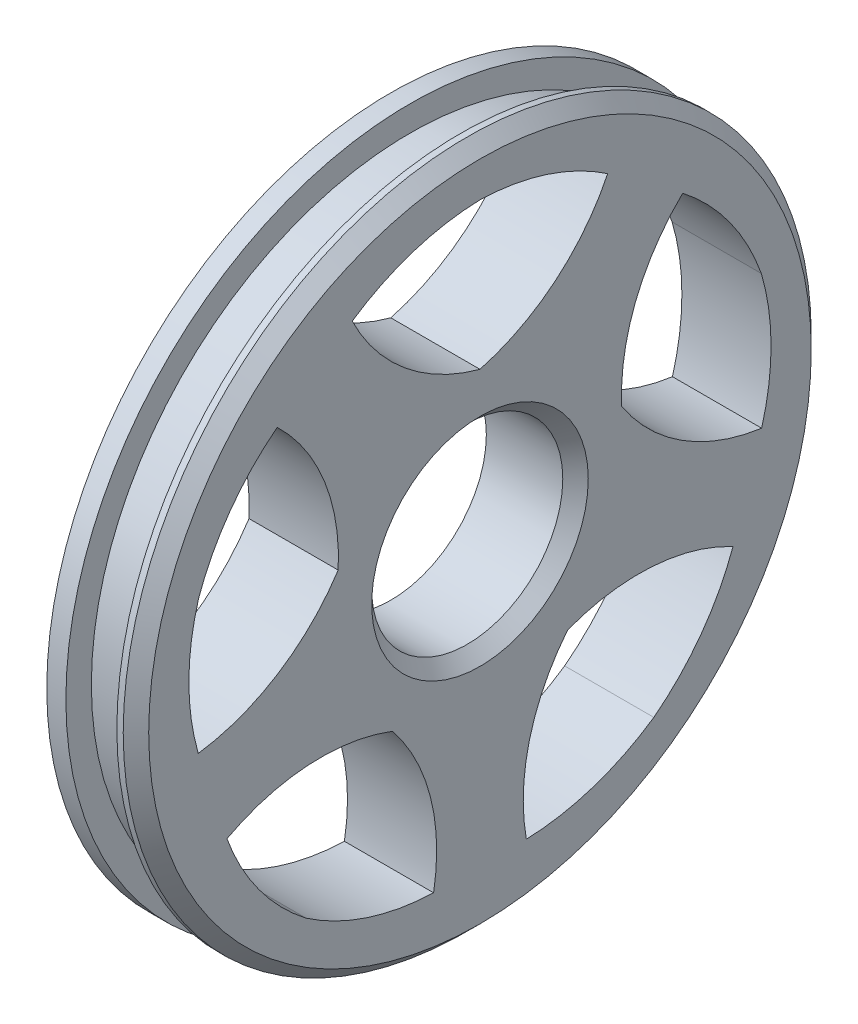
ISO-10303-21;
HEADER;
FILE_DESCRIPTION(('STEP AP214'),'2;1');
FILE_NAME('part.step','',(''),(''),'','','');
FILE_SCHEMA(('AUTOMOTIVE_DESIGN { 1 0 10303 214 1 1 1 1 }'));
ENDSEC;
DATA;
#1=APPLICATION_CONTEXT('core data for automotive mechanical design processes');
#2=APPLICATION_PROTOCOL_DEFINITION('international standard','automotive_design',2000,#1);
#3=PRODUCT_CONTEXT('',#1,'mechanical');
#4=PRODUCT('Part','Part','',(#3));
#5=PRODUCT_RELATED_PRODUCT_CATEGORY('part','',(#4));
#6=PRODUCT_DEFINITION_FORMATION('','',#4);
#7=PRODUCT_DEFINITION_CONTEXT('part definition',#1,'design');
#8=PRODUCT_DEFINITION('design','',#6,#7);
#9=PRODUCT_DEFINITION_SHAPE('','',#8);
#10=(LENGTH_UNIT() NAMED_UNIT(*) SI_UNIT(.MILLI.,.METRE.));
#11=(NAMED_UNIT(*) PLANE_ANGLE_UNIT() SI_UNIT($,.RADIAN.));
#12=(NAMED_UNIT(*) SI_UNIT($,.STERADIAN.) SOLID_ANGLE_UNIT());
#13=UNCERTAINTY_MEASURE_WITH_UNIT(LENGTH_MEASURE(1.E-05),#10,'distance_accuracy_value','');
#14=(GEOMETRIC_REPRESENTATION_CONTEXT(3) GLOBAL_UNCERTAINTY_ASSIGNED_CONTEXT((#13)) GLOBAL_UNIT_ASSIGNED_CONTEXT((#10,
#11,#12)) REPRESENTATION_CONTEXT('',''));
#15=CARTESIAN_POINT('',(0.,0.,0.));
#16=DIRECTION('',(0.,0.,1.));
#17=DIRECTION('',(1.,0.,0.));
#18=AXIS2_PLACEMENT_3D('',#15,#16,#17);
#19=CARTESIAN_POINT('',(1.75,0.,0.));
#20=DIRECTION('',(-1.,0.,0.));
#21=DIRECTION('',(0.,0.,1.));
#22=AXIS2_PLACEMENT_3D('',#19,#20,#21);
#23=CYLINDRICAL_SURFACE('',#22,13.5);
#24=CARTESIAN_POINT('',(-1.75,0.,0.));
#25=DIRECTION('',(1.,0.,0.));
#26=DIRECTION('',(0.,0.,-1.));
#27=AXIS2_PLACEMENT_3D('',#24,#25,#26);
#28=CIRCLE('',#27,13.5);
#29=CARTESIAN_POINT('',(-1.75,0.,-13.5));
#30=VERTEX_POINT('',#29);
#31=EDGE_CURVE('E341',#30,#30,#28,.T.);
#32=ORIENTED_EDGE('',*,*,#31,.T.);
#33=EDGE_LOOP('',(#32));
#34=FACE_BOUND('',#33,.T.);
#35=CARTESIAN_POINT('',(-1.,0.,0.));
#36=DIRECTION('',(1.,0.,0.));
#37=DIRECTION('',(0.,0.,-1.));
#38=AXIS2_PLACEMENT_3D('',#35,#36,#37);
#39=CIRCLE('',#38,13.5);
#40=CARTESIAN_POINT('',(-1.,0.,-13.5));
#41=VERTEX_POINT('',#40);
#42=EDGE_CURVE('E255',#41,#41,#39,.T.);
#43=ORIENTED_EDGE('',*,*,#42,.F.);
#44=EDGE_LOOP('',(#43));
#45=FACE_BOUND('',#44,.T.);
#46=ADVANCED_FACE('F37',(#34,#45),#23,.T.);
#47=CARTESIAN_POINT('',(1.75,0.,0.));
#48=DIRECTION('',(1.,0.,0.));
#49=DIRECTION('',(0.,0.,-1.));
#50=AXIS2_PLACEMENT_3D('',#47,#48,#49);
#51=PLANE('',#50);
#52=CARTESIAN_POINT('',(1.75,0.,0.));
#53=DIRECTION('',(1.,0.,0.));
#54=DIRECTION('',(0.,0.,-1.));
#55=AXIS2_PLACEMENT_3D('',#52,#53,#54);
#56=CIRCLE('',#55,4.25);
#57=CARTESIAN_POINT('',(1.75,0.,-4.25));
#58=VERTEX_POINT('',#57);
#59=EDGE_CURVE('E46',#58,#58,#56,.F.);
#60=ORIENTED_EDGE('',*,*,#59,.T.);
#61=EDGE_LOOP('',(#60));
#62=FACE_BOUND('',#61,.T.);
#63=CARTESIAN_POINT('',(1.75,0.,0.));
#64=DIRECTION('',(1.,0.,0.));
#65=DIRECTION('',(0.,0.,-1.));
#66=AXIS2_PLACEMENT_3D('',#63,#64,#65);
#67=CIRCLE('',#66,13.);
#68=CARTESIAN_POINT('',(1.75,0.,-13.));
#69=VERTEX_POINT('',#68);
#70=EDGE_CURVE('E347',#69,#69,#67,.T.);
#71=ORIENTED_EDGE('',*,*,#70,.T.);
#72=EDGE_LOOP('',(#71));
#73=FACE_BOUND('',#72,.T.);
#74=CARTESIAN_POINT('',(1.75,0.931815794103075,-2.02933749414677));
#75=DIRECTION('',(1.,0.,0.));
#76=DIRECTION('',(0.,-0.95105651629515,-0.309016994374958));
#77=AXIS2_PLACEMENT_3D('',#74,#75,#76);
#78=CIRCLE('',#77,9.39432433543306);
#79=CARTESIAN_POINT('',(1.75,-1.678595206542,-11.0536980879518));
#80=VERTEX_POINT('',#79);
#81=CARTESIAN_POINT('',(1.75,3.58728925984448,-11.0405410981085));
#82=VERTEX_POINT('',#81);
#83=EDGE_CURVE('E266',#80,#82,#78,.T.);
#84=ORIENTED_EDGE('',*,*,#83,.F.);
#85=CARTESIAN_POINT('',(1.75,6.08419028301145,-12.1309249973145));
#86=DIRECTION('',(1.,0.,0.));
#87=DIRECTION('',(0.,-0.95105651629515,-0.309016994374958));
#88=AXIS2_PLACEMENT_3D('',#85,#86,#87);
#89=CIRCLE('',#88,7.8371714521935);
#90=CARTESIAN_POINT('',(1.75,1.80765526838161,-5.56339086038598));
#91=VERTEX_POINT('',#90);
#92=EDGE_CURVE('E264',#91,#80,#89,.T.);
#93=ORIENTED_EDGE('',*,*,#92,.F.);
#94=CARTESIAN_POINT('',(1.75,2.2081654741207,-13.3903218008106));
#95=DIRECTION('',(1.,0.,0.));
#96=DIRECTION('',(0.,0.95105651629515,0.309016994374958));
#97=AXIS2_PLACEMENT_3D('',#94,#95,#96);
#98=CIRCLE('',#97,7.8371714521935);
#99=CARTESIAN_POINT('',(1.75,7.85521276816055,-7.95597609686846));
#100=VERTEX_POINT('',#99);
#101=EDGE_CURVE('E270',#100,#91,#98,.T.);
#102=ORIENTED_EDGE('',*,*,#101,.F.);
#103=CARTESIAN_POINT('',(1.75,0.43895983792731,-2.18947610171399));
#104=DIRECTION('',(1.,0.,0.));
#105=DIRECTION('',(0.,0.95105651629515,0.309016994374958));
#106=AXIS2_PLACEMENT_3D('',#103,#104,#105);
#107=CIRCLE('',#106,9.39432433543306);
#108=EDGE_CURVE('E268',#82,#100,#107,.T.);
#109=ORIENTED_EDGE('',*,*,#108,.F.);
#110=EDGE_LOOP('',(#84,#93,#102,#109));
#111=FACE_BOUND('',#110,.T.);
#112=CARTESIAN_POINT('',(1.75,-1.64206773156553,-1.51330925598209));
#113=DIRECTION('',(1.,0.,0.));
#114=DIRECTION('',(0.,-0.58778525229248,0.809016994374942));
#115=AXIS2_PLACEMENT_3D('',#112,#113,#114);
#116=CIRCLE('',#115,9.39432433543306);
#117=CARTESIAN_POINT('',(1.75,-11.0314060412036,-1.81934165046336));
#118=VERTEX_POINT('',#117);
#119=CARTESIAN_POINT('',(1.75,-9.3916452097499,-6.82342965282126));
#120=VERTEX_POINT('',#119);
#121=EDGE_CURVE('E240',#118,#120,#116,.T.);
#122=ORIENTED_EDGE('',*,*,#121,.F.);
#123=CARTESIAN_POINT('',(1.75,-9.65707707292231,-9.53507079669572));
#124=DIRECTION('',(1.,0.,0.));
#125=DIRECTION('',(0.,-0.58778525229248,0.809016994374942));
#126=AXIS2_PLACEMENT_3D('',#123,#124,#125);
#127=CIRCLE('',#126,7.8371714521935);
#128=CARTESIAN_POINT('',(1.75,-4.73250293256568,-3.43836464441911));
#129=VERTEX_POINT('',#128);
#130=EDGE_CURVE('E238',#129,#118,#127,.T.);
#131=ORIENTED_EDGE('',*,*,#130,.F.);
#132=CARTESIAN_POINT('',(1.75,-12.0525921460546,-6.23792715982025));
#133=DIRECTION('',(1.,0.,0.));
#134=DIRECTION('',(0.,0.58778525229248,-0.809016994374942));
#135=AXIS2_PLACEMENT_3D('',#132,#133,#134);
#136=CIRCLE('',#135,7.8371714521935);
#137=CARTESIAN_POINT('',(1.75,-5.13918867062257,-9.92928311081719));
#138=VERTEX_POINT('',#137);
#139=EDGE_CURVE('E244',#138,#129,#136,.T.);
#140=ORIENTED_EDGE('',*,*,#139,.F.);
#141=CARTESIAN_POINT('',(1.75,-1.94666946403999,-1.09406093846006));
#142=DIRECTION('',(1.,0.,0.));
#143=DIRECTION('',(0.,0.58778525229248,-0.809016994374942));
#144=AXIS2_PLACEMENT_3D('',#141,#142,#143);
#145=CIRCLE('',#144,9.39432433543306);
#146=EDGE_CURVE('E242',#120,#138,#145,.T.);
#147=ORIENTED_EDGE('',*,*,#146,.F.);
#148=EDGE_LOOP('',(#122,#131,#140,#147));
#149=FACE_BOUND('',#148,.T.);
#150=CARTESIAN_POINT('',(1.75,-1.94666946404,1.09406093846003));
#151=DIRECTION('',(1.,0.,0.));
#152=DIRECTION('',(0.,0.587785252292469,0.809016994374951));
#153=AXIS2_PLACEMENT_3D('',#150,#151,#152);
#154=CIRCLE('',#153,9.39432433543306);
#155=CARTESIAN_POINT('',(1.75,-5.13918867062272,9.92928311081712));
#156=VERTEX_POINT('',#155);
#157=CARTESIAN_POINT('',(1.75,-9.39164520975,6.82342965282112));
#158=VERTEX_POINT('',#157);
#159=EDGE_CURVE('E213',#156,#158,#154,.T.);
#160=ORIENTED_EDGE('',*,*,#159,.F.);
#161=CARTESIAN_POINT('',(1.75,-12.0525921460547,6.23792715982008));
#162=DIRECTION('',(1.,0.,0.));
#163=DIRECTION('',(0.,0.587785252292469,0.809016994374951));
#164=AXIS2_PLACEMENT_3D('',#161,#162,#163);
#165=CIRCLE('',#164,7.8371714521935);
#166=CARTESIAN_POINT('',(1.75,-4.73250293256573,3.43836464441905));
#167=VERTEX_POINT('',#166);
#168=EDGE_CURVE('E182',#167,#156,#165,.T.);
#169=ORIENTED_EDGE('',*,*,#168,.F.);
#170=CARTESIAN_POINT('',(1.75,-9.65707707292245,9.53507079669558));
#171=DIRECTION('',(1.,0.,0.));
#172=DIRECTION('',(0.,-0.587785252292469,-0.809016994374951));
#173=AXIS2_PLACEMENT_3D('',#170,#171,#172);
#174=CIRCLE('',#173,7.8371714521935);
#175=CARTESIAN_POINT('',(1.75,-11.0314060412037,1.81934165046321));
#176=VERTEX_POINT('',#175);
#177=EDGE_CURVE('E218',#176,#167,#174,.T.);
#178=ORIENTED_EDGE('',*,*,#177,.F.);
#179=CARTESIAN_POINT('',(1.75,-1.64206773156555,1.51330925598207));
#180=DIRECTION('',(1.,0.,0.));
#181=DIRECTION('',(0.,-0.587785252292469,-0.809016994374951));
#182=AXIS2_PLACEMENT_3D('',#179,#180,#181);
#183=CIRCLE('',#182,9.39432433543306);
#184=EDGE_CURVE('E215',#158,#176,#183,.T.);
#185=ORIENTED_EDGE('',*,*,#184,.F.);
#186=EDGE_LOOP('',(#160,#169,#178,#185));
#187=FACE_BOUND('',#186,.T.);
#188=CARTESIAN_POINT('',(1.75,0.438959837927279,2.18947610171399));
#189=DIRECTION('',(1.,0.,0.));
#190=DIRECTION('',(0.,0.951056516295155,-0.309016994374945));
#191=AXIS2_PLACEMENT_3D('',#188,#189,#190);
#192=CIRCLE('',#191,9.39432433543306);
#193=CARTESIAN_POINT('',(1.75,7.85521276816044,7.95597609686858));
#194=VERTEX_POINT('',#193);
#195=CARTESIAN_POINT('',(1.75,3.58728925984432,11.0405410981086));
#196=VERTEX_POINT('',#195);
#197=EDGE_CURVE('E292',#194,#196,#192,.T.);
#198=ORIENTED_EDGE('',*,*,#197,.F.);
#199=CARTESIAN_POINT('',(1.75,2.20816547412051,13.3903218008106));
#200=DIRECTION('',(1.,0.,0.));
#201=DIRECTION('',(0.,0.951056516295155,-0.309016994374945));
#202=AXIS2_PLACEMENT_3D('',#199,#200,#201);
#203=CIRCLE('',#202,7.8371714521935);
#204=CARTESIAN_POINT('',(1.75,1.80765526838153,5.56339086038601));
#205=VERTEX_POINT('',#204);
#206=EDGE_CURVE('E290',#205,#194,#203,.T.);
#207=ORIENTED_EDGE('',*,*,#206,.F.);
#208=CARTESIAN_POINT('',(1.75,6.08419028301128,12.1309249973146));
#209=DIRECTION('',(1.,0.,0.));
#210=DIRECTION('',(0.,-0.951056516295155,0.309016994374945));
#211=AXIS2_PLACEMENT_3D('',#208,#209,#210);
#212=CIRCLE('',#211,7.8371714521935);
#213=CARTESIAN_POINT('',(1.75,-1.67859520654215,11.0536980879518));
#214=VERTEX_POINT('',#213);
#215=EDGE_CURVE('E297',#214,#205,#212,.T.);
#216=ORIENTED_EDGE('',*,*,#215,.F.);
#217=CARTESIAN_POINT('',(1.75,0.931815794103047,2.02933749414678));
#218=DIRECTION('',(1.,0.,0.));
#219=DIRECTION('',(0.,-0.951056516295155,0.309016994374945));
#220=AXIS2_PLACEMENT_3D('',#217,#218,#219);
#221=CIRCLE('',#220,9.39432433543306);
#222=EDGE_CURVE('E294',#196,#214,#221,.T.);
#223=ORIENTED_EDGE('',*,*,#222,.F.);
#224=EDGE_LOOP('',(#198,#207,#216,#223));
#225=FACE_BOUND('',#224,.T.);
#226=CARTESIAN_POINT('',(1.75,2.21796156357521,0.259109709954825));
#227=DIRECTION('',(1.,0.,0.));
#228=DIRECTION('',(0.,0.,-1.));
#229=AXIS2_PLACEMENT_3D('',#226,#227,#228);
#230=CIRCLE('',#229,9.39432433543306);
#231=CARTESIAN_POINT('',(1.75,9.99397715020798,-5.01221946927066));
#232=VERTEX_POINT('',#231);
#233=CARTESIAN_POINT('',(1.75,11.6087118998112,0.));
#234=VERTEX_POINT('',#233);
#235=EDGE_CURVE('E322',#232,#234,#230,.T.);
#236=ORIENTED_EDGE('',*,*,#235,.F.);
#237=CARTESIAN_POINT('',(1.75,13.4173134618452,2.03774683337949));
#238=DIRECTION('',(1.,0.,0.));
#239=DIRECTION('',(0.,0.,-1.));
#240=AXIS2_PLACEMENT_3D('',#237,#238,#239);
#241=CIRCLE('',#240,7.8371714521935);
#242=CARTESIAN_POINT('',(1.75,5.84969532836832,0.));
#243=VERTEX_POINT('',#242);
#244=EDGE_CURVE('E320',#243,#232,#241,.T.);
#245=ORIENTED_EDGE('',*,*,#244,.F.);
#246=CARTESIAN_POINT('',(1.75,13.4173134618452,-2.03774683337949));
#247=DIRECTION('',(1.,0.,0.));
#248=DIRECTION('',(0.,0.,1.));
#249=AXIS2_PLACEMENT_3D('',#246,#247,#248);
#250=CIRCLE('',#249,7.8371714521935);
#251=CARTESIAN_POINT('',(1.75,9.99397715020798,5.01221946927066));
#252=VERTEX_POINT('',#251);
#253=EDGE_CURVE('E327',#252,#243,#250,.T.);
#254=ORIENTED_EDGE('',*,*,#253,.F.);
#255=CARTESIAN_POINT('',(1.75,2.21796156357521,-0.259109709954825));
#256=DIRECTION('',(1.,0.,0.));
#257=DIRECTION('',(0.,0.,1.));
#258=AXIS2_PLACEMENT_3D('',#255,#256,#257);
#259=CIRCLE('',#258,9.39432433543306);
#260=EDGE_CURVE('E324',#234,#252,#259,.T.);
#261=ORIENTED_EDGE('',*,*,#260,.F.);
#262=EDGE_LOOP('',(#236,#245,#254,#261));
#263=FACE_BOUND('',#262,.T.);
#264=ADVANCED_FACE('F352',(#62,#73,#111,#149,#187,#225,#263),#51,.T.);
#265=CARTESIAN_POINT('',(-1.75,0.,0.));
#266=DIRECTION('',(1.,0.,0.));
#267=DIRECTION('',(0.,0.,-1.));
#268=AXIS2_PLACEMENT_3D('',#265,#266,#267);
#269=PLANE('',#268);
#270=CARTESIAN_POINT('',(-1.75,6.08419028301145,-12.1309249973145));
#271=DIRECTION('',(1.,0.,0.));
#272=DIRECTION('',(0.,-0.95105651629515,-0.309016994374958));
#273=AXIS2_PLACEMENT_3D('',#270,#271,#272);
#274=CIRCLE('',#273,7.8371714521935);
#275=CARTESIAN_POINT('',(-1.75,1.80765526838161,-5.56339086038598));
#276=VERTEX_POINT('',#275);
#277=CARTESIAN_POINT('',(-1.75,-1.678595206542,-11.0536980879518));
#278=VERTEX_POINT('',#277);
#279=EDGE_CURVE('E251',#276,#278,#274,.T.);
#280=ORIENTED_EDGE('',*,*,#279,.T.);
#281=CARTESIAN_POINT('',(-1.75,0.931815794103075,-2.02933749414677));
#282=DIRECTION('',(1.,0.,0.));
#283=DIRECTION('',(0.,-0.95105651629515,-0.309016994374958));
#284=AXIS2_PLACEMENT_3D('',#281,#282,#283);
#285=CIRCLE('',#284,9.39432433543306);
#286=CARTESIAN_POINT('',(-1.75,3.58728925984448,-11.0405410981085));
#287=VERTEX_POINT('',#286);
#288=EDGE_CURVE('E254',#278,#287,#285,.T.);
#289=ORIENTED_EDGE('',*,*,#288,.T.);
#290=CARTESIAN_POINT('',(-1.75,0.43895983792731,-2.18947610171399));
#291=DIRECTION('',(1.,0.,0.));
#292=DIRECTION('',(0.,0.95105651629515,0.309016994374958));
#293=AXIS2_PLACEMENT_3D('',#290,#291,#292);
#294=CIRCLE('',#293,9.39432433543306);
#295=CARTESIAN_POINT('',(-1.75,7.85521276816055,-7.95597609686846));
#296=VERTEX_POINT('',#295);
#297=EDGE_CURVE('E258',#287,#296,#294,.T.);
#298=ORIENTED_EDGE('',*,*,#297,.T.);
#299=CARTESIAN_POINT('',(-1.75,2.2081654741207,-13.3903218008106));
#300=DIRECTION('',(1.,0.,0.));
#301=DIRECTION('',(0.,0.95105651629515,0.309016994374958));
#302=AXIS2_PLACEMENT_3D('',#299,#300,#301);
#303=CIRCLE('',#302,7.8371714521935);
#304=EDGE_CURVE('E261',#296,#276,#303,.T.);
#305=ORIENTED_EDGE('',*,*,#304,.T.);
#306=EDGE_LOOP('',(#280,#289,#298,#305));
#307=FACE_BOUND('',#306,.T.);
#308=CARTESIAN_POINT('',(-1.75,-9.65707707292231,-9.53507079669572));
#309=DIRECTION('',(1.,0.,0.));
#310=DIRECTION('',(0.,-0.58778525229248,0.809016994374942));
#311=AXIS2_PLACEMENT_3D('',#308,#309,#310);
#312=CIRCLE('',#311,7.8371714521935);
#313=CARTESIAN_POINT('',(-1.75,-4.73250293256567,-3.43836464441911));
#314=VERTEX_POINT('',#313);
#315=CARTESIAN_POINT('',(-1.75,-11.0314060412036,-1.81934165046336));
#316=VERTEX_POINT('',#315);
#317=EDGE_CURVE('E225',#314,#316,#312,.T.);
#318=ORIENTED_EDGE('',*,*,#317,.T.);
#319=CARTESIAN_POINT('',(-1.75,-1.64206773156553,-1.51330925598209));
#320=DIRECTION('',(1.,0.,0.));
#321=DIRECTION('',(0.,-0.58778525229248,0.809016994374942));
#322=AXIS2_PLACEMENT_3D('',#319,#320,#321);
#323=CIRCLE('',#322,9.39432433543306);
#324=CARTESIAN_POINT('',(-1.75,-9.3916452097499,-6.82342965282126));
#325=VERTEX_POINT('',#324);
#326=EDGE_CURVE('E228',#316,#325,#323,.T.);
#327=ORIENTED_EDGE('',*,*,#326,.T.);
#328=CARTESIAN_POINT('',(-1.75,-1.94666946403999,-1.09406093846006));
#329=DIRECTION('',(1.,0.,0.));
#330=DIRECTION('',(0.,0.58778525229248,-0.809016994374942));
#331=AXIS2_PLACEMENT_3D('',#328,#329,#330);
#332=CIRCLE('',#331,9.39432433543306);
#333=CARTESIAN_POINT('',(-1.75,-5.13918867062257,-9.92928311081719));
#334=VERTEX_POINT('',#333);
#335=EDGE_CURVE('E232',#325,#334,#332,.T.);
#336=ORIENTED_EDGE('',*,*,#335,.T.);
#337=CARTESIAN_POINT('',(-1.75,-12.0525921460546,-6.23792715982025));
#338=DIRECTION('',(1.,0.,0.));
#339=DIRECTION('',(0.,0.58778525229248,-0.809016994374942));
#340=AXIS2_PLACEMENT_3D('',#337,#338,#339);
#341=CIRCLE('',#340,7.8371714521935);
#342=EDGE_CURVE('E235',#334,#314,#341,.T.);
#343=ORIENTED_EDGE('',*,*,#342,.T.);
#344=EDGE_LOOP('',(#318,#327,#336,#343));
#345=FACE_BOUND('',#344,.T.);
#346=CARTESIAN_POINT('',(-1.75,-12.0525921460547,6.23792715982008));
#347=DIRECTION('',(1.,0.,0.));
#348=DIRECTION('',(0.,0.587785252292469,0.809016994374951));
#349=AXIS2_PLACEMENT_3D('',#346,#347,#348);
#350=CIRCLE('',#349,7.8371714521935);
#351=CARTESIAN_POINT('',(-1.75,-4.73250293256573,3.43836464441905));
#352=VERTEX_POINT('',#351);
#353=CARTESIAN_POINT('',(-1.75,-5.13918867062272,9.92928311081712));
#354=VERTEX_POINT('',#353);
#355=EDGE_CURVE('E179',#352,#354,#350,.T.);
#356=ORIENTED_EDGE('',*,*,#355,.T.);
#357=CARTESIAN_POINT('',(-1.75,-1.94666946404,1.09406093846003));
#358=DIRECTION('',(1.,0.,0.));
#359=DIRECTION('',(0.,0.587785252292469,0.809016994374951));
#360=AXIS2_PLACEMENT_3D('',#357,#358,#359);
#361=CIRCLE('',#360,9.39432433543306);
#362=CARTESIAN_POINT('',(-1.75,-9.39164520975,6.82342965282112));
#363=VERTEX_POINT('',#362);
#364=EDGE_CURVE('E189',#354,#363,#361,.T.);
#365=ORIENTED_EDGE('',*,*,#364,.T.);
#366=CARTESIAN_POINT('',(-1.75,-1.64206773156555,1.51330925598207));
#367=DIRECTION('',(1.,0.,0.));
#368=DIRECTION('',(0.,-0.587785252292469,-0.809016994374951));
#369=AXIS2_PLACEMENT_3D('',#366,#367,#368);
#370=CIRCLE('',#369,9.39432433543306);
#371=CARTESIAN_POINT('',(-1.75,-11.0314060412037,1.8193416504632));
#372=VERTEX_POINT('',#371);
#373=EDGE_CURVE('E195',#363,#372,#370,.T.);
#374=ORIENTED_EDGE('',*,*,#373,.T.);
#375=CARTESIAN_POINT('',(-1.75,-9.65707707292245,9.53507079669558));
#376=DIRECTION('',(1.,0.,0.));
#377=DIRECTION('',(0.,-0.587785252292469,-0.809016994374951));
#378=AXIS2_PLACEMENT_3D('',#375,#376,#377);
#379=CIRCLE('',#378,7.8371714521935);
#380=EDGE_CURVE('E201',#372,#352,#379,.T.);
#381=ORIENTED_EDGE('',*,*,#380,.T.);
#382=EDGE_LOOP('',(#356,#365,#374,#381));
#383=FACE_BOUND('',#382,.T.);
#384=CARTESIAN_POINT('',(-1.75,2.20816547412051,13.3903218008106));
#385=DIRECTION('',(1.,0.,0.));
#386=DIRECTION('',(0.,0.951056516295155,-0.309016994374945));
#387=AXIS2_PLACEMENT_3D('',#384,#385,#386);
#388=CIRCLE('',#387,7.8371714521935);
#389=CARTESIAN_POINT('',(-1.75,1.80765526838153,5.56339086038601));
#390=VERTEX_POINT('',#389);
#391=CARTESIAN_POINT('',(-1.75,7.85521276816044,7.95597609686858));
#392=VERTEX_POINT('',#391);
#393=EDGE_CURVE('E185',#390,#392,#388,.T.);
#394=ORIENTED_EDGE('',*,*,#393,.T.);
#395=CARTESIAN_POINT('',(-1.75,0.438959837927279,2.18947610171399));
#396=DIRECTION('',(1.,0.,0.));
#397=DIRECTION('',(0.,0.951056516295155,-0.309016994374945));
#398=AXIS2_PLACEMENT_3D('',#395,#396,#397);
#399=CIRCLE('',#398,9.39432433543306);
#400=CARTESIAN_POINT('',(-1.75,3.58728925984432,11.0405410981086));
#401=VERTEX_POINT('',#400);
#402=EDGE_CURVE('E281',#392,#401,#399,.T.);
#403=ORIENTED_EDGE('',*,*,#402,.T.);
#404=CARTESIAN_POINT('',(-1.75,0.931815794103047,2.02933749414678));
#405=DIRECTION('',(1.,0.,0.));
#406=DIRECTION('',(0.,-0.951056516295155,0.309016994374945));
#407=AXIS2_PLACEMENT_3D('',#404,#405,#406);
#408=CIRCLE('',#407,9.39432433543306);
#409=CARTESIAN_POINT('',(-1.75,-1.67859520654215,11.0536980879518));
#410=VERTEX_POINT('',#409);
#411=EDGE_CURVE('E284',#401,#410,#408,.T.);
#412=ORIENTED_EDGE('',*,*,#411,.T.);
#413=CARTESIAN_POINT('',(-1.75,6.08419028301128,12.1309249973146));
#414=DIRECTION('',(1.,0.,0.));
#415=DIRECTION('',(0.,-0.951056516295155,0.309016994374945));
#416=AXIS2_PLACEMENT_3D('',#413,#414,#415);
#417=CIRCLE('',#416,7.8371714521935);
#418=EDGE_CURVE('E287',#410,#390,#417,.T.);
#419=ORIENTED_EDGE('',*,*,#418,.T.);
#420=EDGE_LOOP('',(#394,#403,#412,#419));
#421=FACE_BOUND('',#420,.T.);
#422=CARTESIAN_POINT('',(-1.75,13.4173134618452,2.03774683337949));
#423=DIRECTION('',(1.,0.,0.));
#424=DIRECTION('',(0.,0.,-1.));
#425=AXIS2_PLACEMENT_3D('',#422,#423,#424);
#426=CIRCLE('',#425,7.8371714521935);
#427=CARTESIAN_POINT('',(-1.75,5.84969532836832,0.));
#428=VERTEX_POINT('',#427);
#429=CARTESIAN_POINT('',(-1.75,9.99397715020798,-5.01221946927066));
#430=VERTEX_POINT('',#429);
#431=EDGE_CURVE('E308',#428,#430,#426,.T.);
#432=ORIENTED_EDGE('',*,*,#431,.T.);
#433=CARTESIAN_POINT('',(-1.75,2.21796156357521,0.259109709954825));
#434=DIRECTION('',(1.,0.,0.));
#435=DIRECTION('',(0.,0.,-1.));
#436=AXIS2_PLACEMENT_3D('',#433,#434,#435);
#437=CIRCLE('',#436,9.39432433543306);
#438=CARTESIAN_POINT('',(-1.75,11.6087118998112,0.));
#439=VERTEX_POINT('',#438);
#440=EDGE_CURVE('E311',#430,#439,#437,.T.);
#441=ORIENTED_EDGE('',*,*,#440,.T.);
#442=CARTESIAN_POINT('',(-1.75,2.21796156357521,-0.259109709954825));
#443=DIRECTION('',(1.,0.,0.));
#444=DIRECTION('',(0.,0.,1.));
#445=AXIS2_PLACEMENT_3D('',#442,#443,#444);
#446=CIRCLE('',#445,9.39432433543306);
#447=CARTESIAN_POINT('',(-1.75,9.99397715020798,5.01221946927066));
#448=VERTEX_POINT('',#447);
#449=EDGE_CURVE('E314',#439,#448,#446,.T.);
#450=ORIENTED_EDGE('',*,*,#449,.T.);
#451=CARTESIAN_POINT('',(-1.75,13.4173134618452,-2.03774683337949));
#452=DIRECTION('',(1.,0.,0.));
#453=DIRECTION('',(0.,0.,1.));
#454=AXIS2_PLACEMENT_3D('',#451,#452,#453);
#455=CIRCLE('',#454,7.8371714521935);
#456=EDGE_CURVE('E317',#448,#428,#455,.T.);
#457=ORIENTED_EDGE('',*,*,#456,.T.);
#458=EDGE_LOOP('',(#432,#441,#450,#457));
#459=FACE_BOUND('',#458,.T.);
#460=ORIENTED_EDGE('',*,*,#31,.F.);
#461=EDGE_LOOP('',(#460));
#462=FACE_BOUND('',#461,.T.);
#463=CARTESIAN_POINT('',(-1.75,0.,0.));
#464=DIRECTION('',(1.,0.,0.));
#465=DIRECTION('',(0.,0.,-1.));
#466=AXIS2_PLACEMENT_3D('',#463,#464,#465);
#467=CIRCLE('',#466,3.75);
#468=CARTESIAN_POINT('',(-1.75,0.,-3.75));
#469=VERTEX_POINT('',#468);
#470=EDGE_CURVE('E338',#469,#469,#467,.T.);
#471=ORIENTED_EDGE('',*,*,#470,.T.);
#472=EDGE_LOOP('',(#471));
#473=FACE_BOUND('',#472,.T.);
#474=ADVANCED_FACE('F198',(#307,#345,#383,#421,#459,#462,#473),#269,.F.);
#475=CARTESIAN_POINT('',(1.,0.,0.));
#476=DIRECTION('',(1.,0.,0.));
#477=DIRECTION('',(0.,0.,-1.));
#478=AXIS2_PLACEMENT_3D('',#475,#476,#477);
#479=CIRCLE('',#478,13.5);
#480=CARTESIAN_POINT('',(1.,0.,-13.5));
#481=VERTEX_POINT('',#480);
#482=EDGE_CURVE('E207',#481,#481,#479,.T.);
#483=ORIENTED_EDGE('',*,*,#482,.T.);
#484=EDGE_LOOP('',(#483));
#485=FACE_BOUND('',#484,.T.);
#486=CARTESIAN_POINT('',(1.24999999999999,0.,0.));
#487=DIRECTION('',(1.,0.,0.));
#488=DIRECTION('',(0.,0.,-1.));
#489=AXIS2_PLACEMENT_3D('',#486,#487,#488);
#490=CIRCLE('',#489,13.5);
#491=CARTESIAN_POINT('',(1.24999999999999,0.,-13.5));
#492=VERTEX_POINT('',#491);
#493=EDGE_CURVE('E11',#492,#492,#490,.F.);
#494=ORIENTED_EDGE('',*,*,#493,.T.);
#495=EDGE_LOOP('',(#494));
#496=FACE_BOUND('',#495,.T.);
#497=ADVANCED_FACE('F365',(#485,#496),#23,.T.);
#498=CARTESIAN_POINT('',(1.75,0.,0.));
#499=DIRECTION('',(-1.,0.,0.));
#500=DIRECTION('',(0.,0.,1.));
#501=AXIS2_PLACEMENT_3D('',#498,#499,#500);
#502=CYLINDRICAL_SURFACE('',#501,3.75);
#503=CARTESIAN_POINT('',(1.25000000000001,0.,0.));
#504=DIRECTION('',(1.,0.,0.));
#505=DIRECTION('',(0.,0.,-1.));
#506=AXIS2_PLACEMENT_3D('',#503,#504,#505);
#507=CIRCLE('',#506,3.75);
#508=CARTESIAN_POINT('',(1.25000000000001,0.,-3.75));
#509=VERTEX_POINT('',#508);
#510=EDGE_CURVE('E344',#509,#509,#507,.T.);
#511=ORIENTED_EDGE('',*,*,#510,.T.);
#512=EDGE_LOOP('',(#511));
#513=FACE_BOUND('',#512,.T.);
#514=ORIENTED_EDGE('',*,*,#470,.F.);
#515=EDGE_LOOP('',(#514));
#516=FACE_BOUND('',#515,.T.);
#517=ADVANCED_FACE('F361',(#513,#516),#502,.F.);
#518=CARTESIAN_POINT('',(1.75,13.4173134618452,2.03774683337949));
#519=DIRECTION('',(-1.,0.,0.));
#520=DIRECTION('',(0.,0.,1.));
#521=AXIS2_PLACEMENT_3D('',#518,#519,#520);
#522=CYLINDRICAL_SURFACE('',#521,7.8371714521935);
#523=DIRECTION('',(-1.,0.,0.));
#524=VECTOR('',#523,1.);
#525=CARTESIAN_POINT('',(1.75,5.84969532836832,0.));
#526=LINE('',#525,#524);
#527=EDGE_CURVE('E329',#243,#428,#526,.T.);
#528=ORIENTED_EDGE('',*,*,#527,.F.);
#529=ORIENTED_EDGE('',*,*,#244,.T.);
#530=DIRECTION('',(-1.,0.,0.));
#531=VECTOR('',#530,1.);
#532=CARTESIAN_POINT('',(1.75,9.99397715020798,-5.01221946927066));
#533=LINE('',#532,#531);
#534=EDGE_CURVE('E336',#232,#430,#533,.T.);
#535=ORIENTED_EDGE('',*,*,#534,.T.);
#536=ORIENTED_EDGE('',*,*,#431,.F.);
#537=EDGE_LOOP('',(#528,#529,#535,#536));
#538=FACE_BOUND('',#537,.T.);
#539=ADVANCED_FACE('F364',(#538),#522,.F.);
#540=CARTESIAN_POINT('',(1.75,2.21796156357521,0.259109709954825));
#541=DIRECTION('',(-1.,0.,0.));
#542=DIRECTION('',(0.,0.,1.));
#543=AXIS2_PLACEMENT_3D('',#540,#541,#542);
#544=CYLINDRICAL_SURFACE('',#543,9.39432433543306);
#545=ORIENTED_EDGE('',*,*,#534,.F.);
#546=ORIENTED_EDGE('',*,*,#235,.T.);
#547=DIRECTION('',(-1.,0.,0.));
#548=VECTOR('',#547,1.);
#549=CARTESIAN_POINT('',(1.75,11.6087118998112,0.));
#550=LINE('',#549,#548);
#551=EDGE_CURVE('E334',#234,#439,#550,.T.);
#552=ORIENTED_EDGE('',*,*,#551,.T.);
#553=ORIENTED_EDGE('',*,*,#440,.F.);
#554=EDGE_LOOP('',(#545,#546,#552,#553));
#555=FACE_BOUND('',#554,.T.);
#556=ADVANCED_FACE('F483',(#555),#544,.F.);
#557=CARTESIAN_POINT('',(1.75,2.21796156357521,-0.259109709954825));
#558=DIRECTION('',(-1.,0.,0.));
#559=DIRECTION('',(0.,0.,1.));
#560=AXIS2_PLACEMENT_3D('',#557,#558,#559);
#561=CYLINDRICAL_SURFACE('',#560,9.39432433543306);
#562=ORIENTED_EDGE('',*,*,#551,.F.);
#563=ORIENTED_EDGE('',*,*,#260,.T.);
#564=DIRECTION('',(-1.,0.,0.));
#565=VECTOR('',#564,1.);
#566=CARTESIAN_POINT('',(1.75,9.99397715020798,5.01221946927066));
#567=LINE('',#566,#565);
#568=EDGE_CURVE('E332',#252,#448,#567,.T.);
#569=ORIENTED_EDGE('',*,*,#568,.T.);
#570=ORIENTED_EDGE('',*,*,#449,.F.);
#571=EDGE_LOOP('',(#562,#563,#569,#570));
#572=FACE_BOUND('',#571,.T.);
#573=ADVANCED_FACE('F479',(#572),#561,.F.);
#574=CARTESIAN_POINT('',(1.75,13.4173134618452,-2.03774683337949));
#575=DIRECTION('',(-1.,0.,0.));
#576=DIRECTION('',(0.,0.,1.));
#577=AXIS2_PLACEMENT_3D('',#574,#575,#576);
#578=CYLINDRICAL_SURFACE('',#577,7.8371714521935);
#579=ORIENTED_EDGE('',*,*,#568,.F.);
#580=ORIENTED_EDGE('',*,*,#253,.T.);
#581=ORIENTED_EDGE('',*,*,#527,.T.);
#582=ORIENTED_EDGE('',*,*,#456,.F.);
#583=EDGE_LOOP('',(#579,#580,#581,#582));
#584=FACE_BOUND('',#583,.T.);
#585=ADVANCED_FACE('F475',(#584),#578,.F.);
#586=CARTESIAN_POINT('',(1.75,2.20816547412051,13.3903218008106));
#587=DIRECTION('',(-1.,0.,0.));
#588=DIRECTION('',(0.,0.,1.));
#589=AXIS2_PLACEMENT_3D('',#586,#587,#588);
#590=CYLINDRICAL_SURFACE('',#589,7.8371714521935);
#591=DIRECTION('',(-1.,0.,0.));
#592=VECTOR('',#591,1.);
#593=CARTESIAN_POINT('',(1.75,1.80765526838153,5.56339086038601));
#594=LINE('',#593,#592);
#595=EDGE_CURVE('E299',#205,#390,#594,.T.);
#596=ORIENTED_EDGE('',*,*,#595,.F.);
#597=ORIENTED_EDGE('',*,*,#206,.T.);
#598=DIRECTION('',(-1.,0.,0.));
#599=VECTOR('',#598,1.);
#600=CARTESIAN_POINT('',(1.75,7.85521276816044,7.95597609686858));
#601=LINE('',#600,#599);
#602=EDGE_CURVE('E306',#194,#392,#601,.T.);
#603=ORIENTED_EDGE('',*,*,#602,.T.);
#604=ORIENTED_EDGE('',*,*,#393,.F.);
#605=EDGE_LOOP('',(#596,#597,#603,#604));
#606=FACE_BOUND('',#605,.T.);
#607=ADVANCED_FACE('F471',(#606),#590,.F.);
#608=CARTESIAN_POINT('',(1.75,0.438959837927279,2.18947610171399));
#609=DIRECTION('',(-1.,0.,0.));
#610=DIRECTION('',(0.,0.,1.));
#611=AXIS2_PLACEMENT_3D('',#608,#609,#610);
#612=CYLINDRICAL_SURFACE('',#611,9.39432433543306);
#613=ORIENTED_EDGE('',*,*,#602,.F.);
#614=ORIENTED_EDGE('',*,*,#197,.T.);
#615=DIRECTION('',(-1.,0.,0.));
#616=VECTOR('',#615,1.);
#617=CARTESIAN_POINT('',(1.75,3.58728925984432,11.0405410981086));
#618=LINE('',#617,#616);
#619=EDGE_CURVE('E304',#196,#401,#618,.T.);
#620=ORIENTED_EDGE('',*,*,#619,.T.);
#621=ORIENTED_EDGE('',*,*,#402,.F.);
#622=EDGE_LOOP('',(#613,#614,#620,#621));
#623=FACE_BOUND('',#622,.T.);
#624=ADVANCED_FACE('F467',(#623),#612,.F.);
#625=CARTESIAN_POINT('',(1.75,0.931815794103047,2.02933749414678));
#626=DIRECTION('',(-1.,0.,0.));
#627=DIRECTION('',(0.,0.,1.));
#628=AXIS2_PLACEMENT_3D('',#625,#626,#627);
#629=CYLINDRICAL_SURFACE('',#628,9.39432433543306);
#630=ORIENTED_EDGE('',*,*,#619,.F.);
#631=ORIENTED_EDGE('',*,*,#222,.T.);
#632=DIRECTION('',(-1.,0.,0.));
#633=VECTOR('',#632,1.);
#634=CARTESIAN_POINT('',(1.75,-1.67859520654215,11.0536980879518));
#635=LINE('',#634,#633);
#636=EDGE_CURVE('E302',#214,#410,#635,.T.);
#637=ORIENTED_EDGE('',*,*,#636,.T.);
#638=ORIENTED_EDGE('',*,*,#411,.F.);
#639=EDGE_LOOP('',(#630,#631,#637,#638));
#640=FACE_BOUND('',#639,.T.);
#641=ADVANCED_FACE('F463',(#640),#629,.F.);
#642=CARTESIAN_POINT('',(1.75,6.08419028301128,12.1309249973146));
#643=DIRECTION('',(-1.,0.,0.));
#644=DIRECTION('',(0.,0.,1.));
#645=AXIS2_PLACEMENT_3D('',#642,#643,#644);
#646=CYLINDRICAL_SURFACE('',#645,7.8371714521935);
#647=ORIENTED_EDGE('',*,*,#636,.F.);
#648=ORIENTED_EDGE('',*,*,#215,.T.);
#649=ORIENTED_EDGE('',*,*,#595,.T.);
#650=ORIENTED_EDGE('',*,*,#418,.F.);
#651=EDGE_LOOP('',(#647,#648,#649,#650));
#652=FACE_BOUND('',#651,.T.);
#653=ADVANCED_FACE('F432',(#652),#646,.F.);
#654=CARTESIAN_POINT('',(1.75,-12.0525921460547,6.23792715982008));
#655=DIRECTION('',(-1.,0.,0.));
#656=DIRECTION('',(0.,0.,1.));
#657=AXIS2_PLACEMENT_3D('',#654,#655,#656);
#658=CYLINDRICAL_SURFACE('',#657,7.8371714521935);
#659=DIRECTION('',(-1.,0.,0.));
#660=VECTOR('',#659,1.);
#661=CARTESIAN_POINT('',(1.75,-4.73250293256573,3.43836464441905));
#662=LINE('',#661,#660);
#663=EDGE_CURVE('E220',#167,#352,#662,.T.);
#664=ORIENTED_EDGE('',*,*,#663,.F.);
#665=ORIENTED_EDGE('',*,*,#168,.T.);
#666=DIRECTION('',(-1.,0.,0.));
#667=VECTOR('',#666,1.);
#668=CARTESIAN_POINT('',(1.75,-5.13918867062272,9.92928311081712));
#669=LINE('',#668,#667);
#670=EDGE_CURVE('E174',#156,#354,#669,.T.);
#671=ORIENTED_EDGE('',*,*,#670,.T.);
#672=ORIENTED_EDGE('',*,*,#355,.F.);
#673=EDGE_LOOP('',(#664,#665,#671,#672));
#674=FACE_BOUND('',#673,.T.);
#675=ADVANCED_FACE('F177',(#674),#658,.F.);
#676=CARTESIAN_POINT('',(1.75,-1.94666946404,1.09406093846003));
#677=DIRECTION('',(-1.,0.,0.));
#678=DIRECTION('',(0.,0.,1.));
#679=AXIS2_PLACEMENT_3D('',#676,#677,#678);
#680=CYLINDRICAL_SURFACE('',#679,9.39432433543306);
#681=ORIENTED_EDGE('',*,*,#670,.F.);
#682=ORIENTED_EDGE('',*,*,#159,.T.);
#683=DIRECTION('',(-1.,0.,0.));
#684=VECTOR('',#683,1.);
#685=CARTESIAN_POINT('',(1.75,-9.39164520975,6.82342965282112));
#686=LINE('',#685,#684);
#687=EDGE_CURVE('E186',#158,#363,#686,.T.);
#688=ORIENTED_EDGE('',*,*,#687,.T.);
#689=ORIENTED_EDGE('',*,*,#364,.F.);
#690=EDGE_LOOP('',(#681,#682,#688,#689));
#691=FACE_BOUND('',#690,.T.);
#692=ADVANCED_FACE('F190',(#691),#680,.F.);
#693=CARTESIAN_POINT('',(1.75,-1.64206773156555,1.51330925598207));
#694=DIRECTION('',(-1.,0.,0.));
#695=DIRECTION('',(0.,0.,1.));
#696=AXIS2_PLACEMENT_3D('',#693,#694,#695);
#697=CYLINDRICAL_SURFACE('',#696,9.39432433543306);
#698=ORIENTED_EDGE('',*,*,#687,.F.);
#699=ORIENTED_EDGE('',*,*,#184,.T.);
#700=DIRECTION('',(-1.,0.,0.));
#701=VECTOR('',#700,1.);
#702=CARTESIAN_POINT('',(1.75,-11.0314060412037,1.8193416504632));
#703=LINE('',#702,#701);
#704=EDGE_CURVE('E222',#176,#372,#703,.T.);
#705=ORIENTED_EDGE('',*,*,#704,.T.);
#706=ORIENTED_EDGE('',*,*,#373,.F.);
#707=EDGE_LOOP('',(#698,#699,#705,#706));
#708=FACE_BOUND('',#707,.T.);
#709=ADVANCED_FACE('F423',(#708),#697,.F.);
#710=CARTESIAN_POINT('',(1.75,-9.65707707292245,9.53507079669558));
#711=DIRECTION('',(-1.,0.,0.));
#712=DIRECTION('',(0.,0.,1.));
#713=AXIS2_PLACEMENT_3D('',#710,#711,#712);
#714=CYLINDRICAL_SURFACE('',#713,7.8371714521935);
#715=ORIENTED_EDGE('',*,*,#704,.F.);
#716=ORIENTED_EDGE('',*,*,#177,.T.);
#717=ORIENTED_EDGE('',*,*,#663,.T.);
#718=ORIENTED_EDGE('',*,*,#380,.F.);
#719=EDGE_LOOP('',(#715,#716,#717,#718));
#720=FACE_BOUND('',#719,.T.);
#721=ADVANCED_FACE('F419',(#720),#714,.F.);
#722=CARTESIAN_POINT('',(1.75,-9.65707707292231,-9.53507079669572));
#723=DIRECTION('',(-1.,0.,0.));
#724=DIRECTION('',(0.,0.,1.));
#725=AXIS2_PLACEMENT_3D('',#722,#723,#724);
#726=CYLINDRICAL_SURFACE('',#725,7.8371714521935);
#727=DIRECTION('',(-1.,0.,0.));
#728=VECTOR('',#727,1.);
#729=CARTESIAN_POINT('',(1.75,-4.73250293256568,-3.43836464441911));
#730=LINE('',#729,#728);
#731=EDGE_CURVE('E246',#129,#314,#730,.T.);
#732=ORIENTED_EDGE('',*,*,#731,.F.);
#733=ORIENTED_EDGE('',*,*,#130,.T.);
#734=DIRECTION('',(-1.,0.,0.));
#735=VECTOR('',#734,1.);
#736=CARTESIAN_POINT('',(1.75,-11.0314060412036,-1.81934165046336));
#737=LINE('',#736,#735);
#738=EDGE_CURVE('E202',#118,#316,#737,.T.);
#739=ORIENTED_EDGE('',*,*,#738,.T.);
#740=ORIENTED_EDGE('',*,*,#317,.F.);
#741=EDGE_LOOP('',(#732,#733,#739,#740));
#742=FACE_BOUND('',#741,.T.);
#743=ADVANCED_FACE('F422',(#742),#726,.F.);
#744=CARTESIAN_POINT('',(1.75,-1.64206773156553,-1.51330925598209));
#745=DIRECTION('',(-1.,0.,0.));
#746=DIRECTION('',(0.,0.,1.));
#747=AXIS2_PLACEMENT_3D('',#744,#745,#746);
#748=CYLINDRICAL_SURFACE('',#747,9.39432433543306);
#749=ORIENTED_EDGE('',*,*,#738,.F.);
#750=ORIENTED_EDGE('',*,*,#121,.T.);
#751=DIRECTION('',(-1.,0.,0.));
#752=VECTOR('',#751,1.);
#753=CARTESIAN_POINT('',(1.75,-9.3916452097499,-6.82342965282126));
#754=LINE('',#753,#752);
#755=EDGE_CURVE('E204',#120,#325,#754,.T.);
#756=ORIENTED_EDGE('',*,*,#755,.T.);
#757=ORIENTED_EDGE('',*,*,#326,.F.);
#758=EDGE_LOOP('',(#749,#750,#756,#757));
#759=FACE_BOUND('',#758,.T.);
#760=ADVANCED_FACE('F440',(#759),#748,.F.);
#761=CARTESIAN_POINT('',(1.75,-1.94666946403999,-1.09406093846006));
#762=DIRECTION('',(-1.,0.,0.));
#763=DIRECTION('',(0.,0.,1.));
#764=AXIS2_PLACEMENT_3D('',#761,#762,#763);
#765=CYLINDRICAL_SURFACE('',#764,9.39432433543306);
#766=ORIENTED_EDGE('',*,*,#755,.F.);
#767=ORIENTED_EDGE('',*,*,#146,.T.);
#768=DIRECTION('',(-1.,0.,0.));
#769=VECTOR('',#768,1.);
#770=CARTESIAN_POINT('',(1.75,-5.13918867062257,-9.92928311081719));
#771=LINE('',#770,#769);
#772=EDGE_CURVE('E61',#138,#334,#771,.T.);
#773=ORIENTED_EDGE('',*,*,#772,.T.);
#774=ORIENTED_EDGE('',*,*,#335,.F.);
#775=EDGE_LOOP('',(#766,#767,#773,#774));
#776=FACE_BOUND('',#775,.T.);
#777=ADVANCED_FACE('F437',(#776),#765,.F.);
#778=CARTESIAN_POINT('',(1.75,-12.0525921460546,-6.23792715982025));
#779=DIRECTION('',(-1.,0.,0.));
#780=DIRECTION('',(0.,0.,1.));
#781=AXIS2_PLACEMENT_3D('',#778,#779,#780);
#782=CYLINDRICAL_SURFACE('',#781,7.8371714521935);
#783=ORIENTED_EDGE('',*,*,#772,.F.);
#784=ORIENTED_EDGE('',*,*,#139,.T.);
#785=ORIENTED_EDGE('',*,*,#731,.T.);
#786=ORIENTED_EDGE('',*,*,#342,.F.);
#787=EDGE_LOOP('',(#783,#784,#785,#786));
#788=FACE_BOUND('',#787,.T.);
#789=ADVANCED_FACE('F433',(#788),#782,.F.);
#790=CARTESIAN_POINT('',(1.75,6.08419028301145,-12.1309249973145));
#791=DIRECTION('',(-1.,0.,0.));
#792=DIRECTION('',(0.,0.,1.));
#793=AXIS2_PLACEMENT_3D('',#790,#791,#792);
#794=CYLINDRICAL_SURFACE('',#793,7.8371714521935);
#795=DIRECTION('',(-1.,0.,0.));
#796=VECTOR('',#795,1.);
#797=CARTESIAN_POINT('',(1.75,1.80765526838161,-5.56339086038598));
#798=LINE('',#797,#796);
#799=EDGE_CURVE('E272',#91,#276,#798,.T.);
#800=ORIENTED_EDGE('',*,*,#799,.F.);
#801=ORIENTED_EDGE('',*,*,#92,.T.);
#802=DIRECTION('',(-1.,0.,0.));
#803=VECTOR('',#802,1.);
#804=CARTESIAN_POINT('',(1.75,-1.678595206542,-11.0536980879518));
#805=LINE('',#804,#803);
#806=EDGE_CURVE('E229',#80,#278,#805,.T.);
#807=ORIENTED_EDGE('',*,*,#806,.T.);
#808=ORIENTED_EDGE('',*,*,#279,.F.);
#809=EDGE_LOOP('',(#800,#801,#807,#808));
#810=FACE_BOUND('',#809,.T.);
#811=ADVANCED_FACE('F436',(#810),#794,.F.);
#812=CARTESIAN_POINT('',(1.75,0.931815794103075,-2.02933749414677));
#813=DIRECTION('',(-1.,0.,0.));
#814=DIRECTION('',(0.,0.,1.));
#815=AXIS2_PLACEMENT_3D('',#812,#813,#814);
#816=CYLINDRICAL_SURFACE('',#815,9.39432433543306);
#817=ORIENTED_EDGE('',*,*,#806,.F.);
#818=ORIENTED_EDGE('',*,*,#83,.T.);
#819=DIRECTION('',(-1.,0.,0.));
#820=VECTOR('',#819,1.);
#821=CARTESIAN_POINT('',(1.75,3.58728925984448,-11.0405410981085));
#822=LINE('',#821,#820);
#823=EDGE_CURVE('E276',#82,#287,#822,.T.);
#824=ORIENTED_EDGE('',*,*,#823,.T.);
#825=ORIENTED_EDGE('',*,*,#288,.F.);
#826=EDGE_LOOP('',(#817,#818,#824,#825));
#827=FACE_BOUND('',#826,.T.);
#828=ADVANCED_FACE('F453',(#827),#816,.F.);
#829=CARTESIAN_POINT('',(1.75,0.43895983792731,-2.18947610171399));
#830=DIRECTION('',(-1.,0.,0.));
#831=DIRECTION('',(0.,0.,1.));
#832=AXIS2_PLACEMENT_3D('',#829,#830,#831);
#833=CYLINDRICAL_SURFACE('',#832,9.39432433543306);
#834=ORIENTED_EDGE('',*,*,#823,.F.);
#835=ORIENTED_EDGE('',*,*,#108,.T.);
#836=DIRECTION('',(-1.,0.,0.));
#837=VECTOR('',#836,1.);
#838=CARTESIAN_POINT('',(1.75,7.85521276816055,-7.95597609686846));
#839=LINE('',#838,#837);
#840=EDGE_CURVE('E53',#100,#296,#839,.T.);
#841=ORIENTED_EDGE('',*,*,#840,.T.);
#842=ORIENTED_EDGE('',*,*,#297,.F.);
#843=EDGE_LOOP('',(#834,#835,#841,#842));
#844=FACE_BOUND('',#843,.T.);
#845=ADVANCED_FACE('F450',(#844),#833,.F.);
#846=CARTESIAN_POINT('',(1.75,2.2081654741207,-13.3903218008106));
#847=DIRECTION('',(-1.,0.,0.));
#848=DIRECTION('',(0.,0.,1.));
#849=AXIS2_PLACEMENT_3D('',#846,#847,#848);
#850=CYLINDRICAL_SURFACE('',#849,7.8371714521935);
#851=ORIENTED_EDGE('',*,*,#840,.F.);
#852=ORIENTED_EDGE('',*,*,#101,.T.);
#853=ORIENTED_EDGE('',*,*,#799,.T.);
#854=ORIENTED_EDGE('',*,*,#304,.F.);
#855=EDGE_LOOP('',(#851,#852,#853,#854));
#856=FACE_BOUND('',#855,.T.);
#857=ADVANCED_FACE('F358',(#856),#850,.F.);
#858=CARTESIAN_POINT('',(1.25000000000001,0.,0.));
#859=DIRECTION('',(1.,0.,0.));
#860=DIRECTION('',(0.,0.,-1.));
#861=AXIS2_PLACEMENT_3D('',#858,#859,#860);
#862=CONICAL_SURFACE('',#861,3.75,0.785398163397452);
#863=ORIENTED_EDGE('',*,*,#59,.F.);
#864=EDGE_LOOP('',(#863));
#865=FACE_BOUND('',#864,.T.);
#866=ORIENTED_EDGE('',*,*,#510,.F.);
#867=EDGE_LOOP('',(#866));
#868=FACE_BOUND('',#867,.T.);
#869=ADVANCED_FACE('F355',(#865,#868),#862,.F.);
#870=CARTESIAN_POINT('',(1.75,0.,0.));
#871=DIRECTION('',(-1.,0.,0.));
#872=DIRECTION('',(0.,0.,1.));
#873=AXIS2_PLACEMENT_3D('',#870,#871,#872);
#874=CONICAL_SURFACE('',#873,13.,0.785398163397443);
#875=ORIENTED_EDGE('',*,*,#493,.F.);
#876=EDGE_LOOP('',(#875));
#877=FACE_BOUND('',#876,.T.);
#878=ORIENTED_EDGE('',*,*,#70,.F.);
#879=EDGE_LOOP('',(#878));
#880=FACE_BOUND('',#879,.T.);
#881=ADVANCED_FACE('F40',(#877,#880),#874,.T.);
#882=CARTESIAN_POINT('',(-1.,0.,0.));
#883=DIRECTION('',(1.,0.,0.));
#884=DIRECTION('',(0.,0.,-1.));
#885=AXIS2_PLACEMENT_3D('',#882,#883,#884);
#886=PLANE('',#885);
#887=CARTESIAN_POINT('',(-1.,0.,0.));
#888=DIRECTION('',(1.,0.,0.));
#889=DIRECTION('',(0.,0.,-1.));
#890=AXIS2_PLACEMENT_3D('',#887,#888,#889);
#891=CIRCLE('',#890,12.5);
#892=CARTESIAN_POINT('',(-1.,0.,-12.5));
#893=VERTEX_POINT('',#892);
#894=EDGE_CURVE('E395',#893,#893,#891,.T.);
#895=ORIENTED_EDGE('',*,*,#894,.F.);
#896=EDGE_LOOP('',(#895));
#897=FACE_BOUND('',#896,.T.);
#898=ORIENTED_EDGE('',*,*,#42,.T.);
#899=EDGE_LOOP('',(#898));
#900=FACE_BOUND('',#899,.T.);
#901=ADVANCED_FACE('F406',(#897,#900),#886,.T.);
#902=CARTESIAN_POINT('',(1.,0.,0.));
#903=DIRECTION('',(1.,0.,0.));
#904=DIRECTION('',(0.,0.,-1.));
#905=AXIS2_PLACEMENT_3D('',#902,#903,#904);
#906=PLANE('',#905);
#907=CARTESIAN_POINT('',(1.,0.,0.));
#908=DIRECTION('',(1.,0.,0.));
#909=DIRECTION('',(0.,0.,-1.));
#910=AXIS2_PLACEMENT_3D('',#907,#908,#909);
#911=CIRCLE('',#910,12.5);
#912=CARTESIAN_POINT('',(1.,0.,-12.5));
#913=VERTEX_POINT('',#912);
#914=EDGE_CURVE('E397',#913,#913,#911,.T.);
#915=ORIENTED_EDGE('',*,*,#914,.T.);
#916=EDGE_LOOP('',(#915));
#917=FACE_BOUND('',#916,.T.);
#918=ORIENTED_EDGE('',*,*,#482,.F.);
#919=EDGE_LOOP('',(#918));
#920=FACE_BOUND('',#919,.T.);
#921=ADVANCED_FACE('F408',(#917,#920),#906,.F.);
#922=CARTESIAN_POINT('',(-1.,0.,0.));
#923=DIRECTION('',(1.,0.,0.));
#924=DIRECTION('',(0.,0.,-1.));
#925=AXIS2_PLACEMENT_3D('',#922,#923,#924);
#926=CYLINDRICAL_SURFACE('',#925,12.5);
#927=ORIENTED_EDGE('',*,*,#894,.T.);
#928=EDGE_LOOP('',(#927));
#929=FACE_BOUND('',#928,.T.);
#930=ORIENTED_EDGE('',*,*,#914,.F.);
#931=EDGE_LOOP('',(#930));
#932=FACE_BOUND('',#931,.T.);
#933=ADVANCED_FACE('F403',(#929,#932),#926,.T.);
#934=CLOSED_SHELL('',(#46,#264,#474,#497,#517,#539,#556,#573,#585,#607,#624,#641,#653,#675,#692,
#709,#721,#743,#760,#777,#789,#811,#828,#845,#857,#869,#881,#901,#921,#933));
#935=MANIFOLD_SOLID_BREP('B2',#934);
#936=ADVANCED_BREP_SHAPE_REPRESENTATION('',(#18,#935),#14);
#937=SHAPE_DEFINITION_REPRESENTATION(#9,#936);
ENDSEC;
END-ISO-10303-21;
